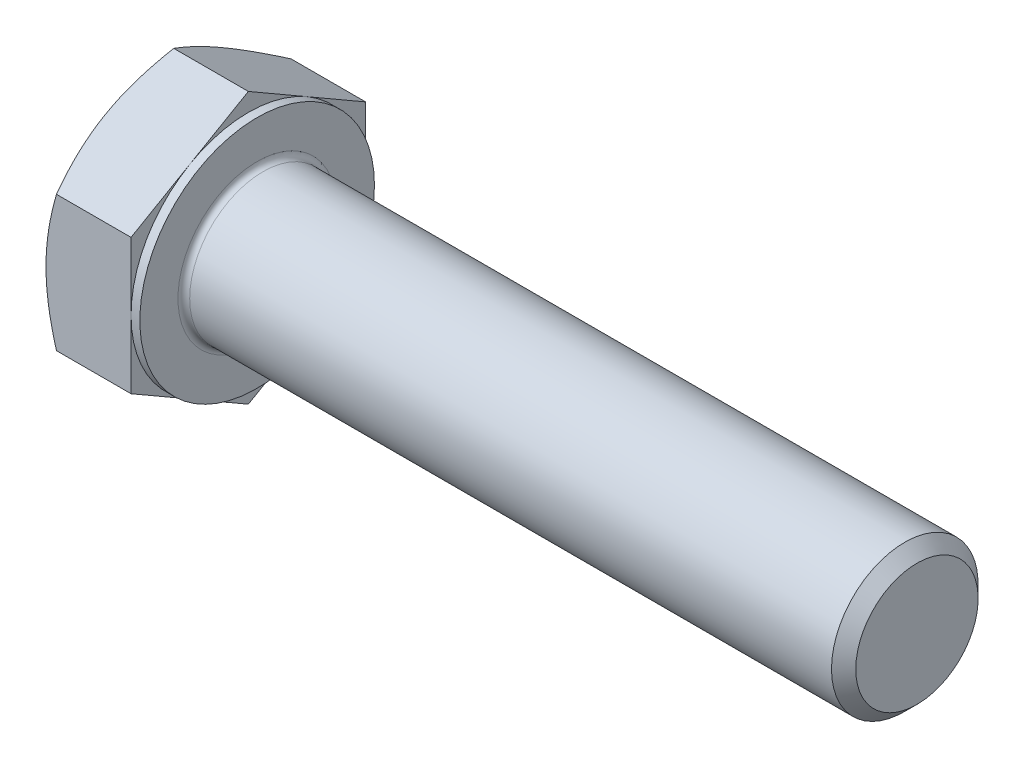
ISO-10303-21;
HEADER;
FILE_DESCRIPTION(('STEP AP214'),'2;1');
FILE_NAME('part.step','',(''),(''),'','','');
FILE_SCHEMA(('AUTOMOTIVE_DESIGN { 1 0 10303 214 1 1 1 1 }'));
ENDSEC;
DATA;
#1=APPLICATION_CONTEXT('core data for automotive mechanical design processes');
#2=APPLICATION_PROTOCOL_DEFINITION('international standard','automotive_design',2000,#1);
#3=PRODUCT_CONTEXT('',#1,'mechanical');
#4=PRODUCT('Part','Part','',(#3));
#5=PRODUCT_RELATED_PRODUCT_CATEGORY('part','',(#4));
#6=PRODUCT_DEFINITION_FORMATION('','',#4);
#7=PRODUCT_DEFINITION_CONTEXT('part definition',#1,'design');
#8=PRODUCT_DEFINITION('design','',#6,#7);
#9=PRODUCT_DEFINITION_SHAPE('','',#8);
#10=(LENGTH_UNIT() NAMED_UNIT(*) SI_UNIT(.MILLI.,.METRE.));
#11=(NAMED_UNIT(*) PLANE_ANGLE_UNIT() SI_UNIT($,.RADIAN.));
#12=(NAMED_UNIT(*) SI_UNIT($,.STERADIAN.) SOLID_ANGLE_UNIT());
#13=UNCERTAINTY_MEASURE_WITH_UNIT(LENGTH_MEASURE(1.E-05),#10,'distance_accuracy_value','');
#14=(GEOMETRIC_REPRESENTATION_CONTEXT(3) GLOBAL_UNCERTAINTY_ASSIGNED_CONTEXT((#13)) GLOBAL_UNIT_ASSIGNED_CONTEXT((#10,
#11,#12)) REPRESENTATION_CONTEXT('',''));
#15=CARTESIAN_POINT('',(0.,0.,0.));
#16=DIRECTION('',(0.,0.,1.));
#17=DIRECTION('',(1.,0.,0.));
#18=AXIS2_PLACEMENT_3D('',#15,#16,#17);
#19=CARTESIAN_POINT('',(6.4,9.23760430703402,0.));
#20=DIRECTION('',(1.,0.,0.));
#21=DIRECTION('',(0.,0.,-1.));
#22=AXIS2_PLACEMENT_3D('',#19,#20,#21);
#23=PLANE('',#22);
#24=CARTESIAN_POINT('',(6.4,0.,0.));
#25=DIRECTION('',(1.,0.,0.));
#26=DIRECTION('',(0.,0.,-1.));
#27=AXIS2_PLACEMENT_3D('',#24,#25,#26);
#28=CIRCLE('',#27,5.4);
#29=CARTESIAN_POINT('',(6.4,0.,-5.4));
#30=VERTEX_POINT('',#29);
#31=EDGE_CURVE('E42',#30,#30,#28,.F.);
#32=ORIENTED_EDGE('',*,*,#31,.T.);
#33=EDGE_LOOP('',(#32));
#34=FACE_BOUND('',#33,.T.);
#35=CARTESIAN_POINT('',(6.4,0.,0.));
#36=DIRECTION('',(1.,0.,0.));
#37=DIRECTION('',(0.,0.,-1.));
#38=AXIS2_PLACEMENT_3D('',#35,#36,#37);
#39=CIRCLE('',#38,8.);
#40=CARTESIAN_POINT('',(6.4,0.,-8.));
#41=VERTEX_POINT('',#40);
#42=EDGE_CURVE('E299',#41,#41,#39,.T.);
#43=ORIENTED_EDGE('',*,*,#42,.T.);
#44=EDGE_LOOP('',(#43));
#45=FACE_BOUND('',#44,.T.);
#46=ADVANCED_FACE('F34',(#34,#45),#23,.T.);
#47=CARTESIAN_POINT('',(0.,0.,0.));
#48=DIRECTION('',(-1.,0.,0.));
#49=DIRECTION('',(0.,0.,1.));
#50=AXIS2_PLACEMENT_3D('',#47,#48,#49);
#51=CYLINDRICAL_SURFACE('',#50,5.);
#52=CARTESIAN_POINT('',(6.8,0.,0.));
#53=DIRECTION('',(1.,0.,0.));
#54=DIRECTION('',(0.,0.,-1.));
#55=AXIS2_PLACEMENT_3D('',#52,#53,#54);
#56=CIRCLE('',#55,5.);
#57=CARTESIAN_POINT('',(6.8,0.,-5.));
#58=VERTEX_POINT('',#57);
#59=EDGE_CURVE('E11',#58,#58,#56,.T.);
#60=ORIENTED_EDGE('',*,*,#59,.T.);
#61=EDGE_LOOP('',(#60));
#62=FACE_BOUND('',#61,.T.);
#63=CARTESIAN_POINT('',(50.572,0.,0.));
#64=DIRECTION('',(-1.,0.,0.));
#65=DIRECTION('',(0.,0.,1.));
#66=AXIS2_PLACEMENT_3D('',#63,#64,#65);
#67=CIRCLE('',#66,5.);
#68=CARTESIAN_POINT('',(50.572,0.,5.));
#69=VERTEX_POINT('',#68);
#70=EDGE_CURVE('E278',#69,#69,#67,.T.);
#71=ORIENTED_EDGE('',*,*,#70,.T.);
#72=EDGE_LOOP('',(#71));
#73=FACE_BOUND('',#72,.T.);
#74=ADVANCED_FACE('F252',(#62,#73),#51,.T.);
#75=CARTESIAN_POINT('',(51.4,0.,0.));
#76=DIRECTION('',(-1.,0.,0.));
#77=DIRECTION('',(0.,0.,1.));
#78=AXIS2_PLACEMENT_3D('',#75,#76,#77);
#79=CONICAL_SURFACE('',#78,4.172,0.785398163397427);
#80=ORIENTED_EDGE('',*,*,#70,.F.);
#81=EDGE_LOOP('',(#80));
#82=FACE_BOUND('',#81,.T.);
#83=CARTESIAN_POINT('',(51.4,0.,0.));
#84=DIRECTION('',(-1.,0.,0.));
#85=DIRECTION('',(0.,0.,1.));
#86=AXIS2_PLACEMENT_3D('',#83,#84,#85);
#87=CIRCLE('',#86,4.172);
#88=CARTESIAN_POINT('',(51.4,0.,4.172));
#89=VERTEX_POINT('',#88);
#90=EDGE_CURVE('E276',#89,#89,#87,.T.);
#91=ORIENTED_EDGE('',*,*,#90,.T.);
#92=EDGE_LOOP('',(#91));
#93=FACE_BOUND('',#92,.T.);
#94=ADVANCED_FACE('F257',(#82,#93),#79,.T.);
#95=CARTESIAN_POINT('',(51.4,0.,0.));
#96=DIRECTION('',(-1.,0.,0.));
#97=DIRECTION('',(0.,0.,1.));
#98=AXIS2_PLACEMENT_3D('',#95,#96,#97);
#99=PLANE('',#98);
#100=ORIENTED_EDGE('',*,*,#90,.F.);
#101=EDGE_LOOP('',(#100));
#102=FACE_BOUND('',#101,.T.);
#103=ADVANCED_FACE('F264',(#102),#99,.F.);
#104=CARTESIAN_POINT('',(5.8,8.,0.));
#105=DIRECTION('',(1.,0.,0.));
#106=DIRECTION('',(0.,0.,-1.));
#107=AXIS2_PLACEMENT_3D('',#104,#105,#106);
#108=PLANE('',#107);
#109=DIRECTION('',(0.,0.500000000000001,0.866025403784438));
#110=VECTOR('',#109,1.);
#111=CARTESIAN_POINT('',(5.8,4.618802153517,-8.));
#112=LINE('',#111,#110);
#113=CARTESIAN_POINT('',(5.8,4.618802153517,-8.));
#114=VERTEX_POINT('',#113);
#115=CARTESIAN_POINT('',(5.8,6.9282032302755,-4.00000000000001));
#116=VERTEX_POINT('',#115);
#117=EDGE_CURVE('E166',#114,#116,#112,.T.);
#118=ORIENTED_EDGE('',*,*,#117,.T.);
#119=CARTESIAN_POINT('',(5.8,0.,0.));
#120=DIRECTION('',(-1.,0.,0.));
#121=DIRECTION('',(0.,0.,1.));
#122=AXIS2_PLACEMENT_3D('',#119,#120,#121);
#123=CIRCLE('',#122,8.);
#124=CARTESIAN_POINT('',(5.8,0.,-8.));
#125=VERTEX_POINT('',#124);
#126=EDGE_CURVE('E49',#116,#125,#123,.T.);
#127=ORIENTED_EDGE('',*,*,#126,.T.);
#128=DIRECTION('',(0.,1.,0.));
#129=VECTOR('',#128,1.);
#130=CARTESIAN_POINT('',(5.8,4.618802153517,-8.));
#131=LINE('',#130,#129);
#132=EDGE_CURVE('E302',#125,#114,#131,.T.);
#133=ORIENTED_EDGE('',*,*,#132,.T.);
#134=EDGE_LOOP('',(#118,#127,#133));
#135=FACE_BOUND('',#134,.T.);
#136=ADVANCED_FACE('F267',(#135),#108,.T.);
#137=CARTESIAN_POINT('',(5.8,9.23760430703402,0.));
#138=VERTEX_POINT('',#137);
#139=EDGE_CURVE('E164',#116,#138,#112,.T.);
#140=ORIENTED_EDGE('',*,*,#139,.T.);
#141=DIRECTION('',(0.,-0.500000000000001,0.866025403784438));
#142=VECTOR('',#141,1.);
#143=CARTESIAN_POINT('',(5.8,9.23760430703402,0.));
#144=LINE('',#143,#142);
#145=CARTESIAN_POINT('',(5.8,6.92820323027551,4.00000000000001));
#146=VERTEX_POINT('',#145);
#147=EDGE_CURVE('E163',#138,#146,#144,.T.);
#148=ORIENTED_EDGE('',*,*,#147,.T.);
#149=EDGE_CURVE('E152',#146,#116,#123,.T.);
#150=ORIENTED_EDGE('',*,*,#149,.T.);
#151=EDGE_LOOP('',(#140,#148,#150));
#152=FACE_BOUND('',#151,.T.);
#153=ADVANCED_FACE('F272',(#152),#108,.T.);
#154=CARTESIAN_POINT('',(5.8,4.618802153517,8.));
#155=VERTEX_POINT('',#154);
#156=EDGE_CURVE('E131',#146,#155,#144,.T.);
#157=ORIENTED_EDGE('',*,*,#156,.T.);
#158=DIRECTION('',(0.,-1.,0.));
#159=VECTOR('',#158,1.);
#160=CARTESIAN_POINT('',(5.8,4.618802153517,8.));
#161=LINE('',#160,#159);
#162=CARTESIAN_POINT('',(5.8,0.,8.));
#163=VERTEX_POINT('',#162);
#164=EDGE_CURVE('E125',#155,#163,#161,.T.);
#165=ORIENTED_EDGE('',*,*,#164,.T.);
#166=EDGE_CURVE('E129',#163,#146,#123,.T.);
#167=ORIENTED_EDGE('',*,*,#166,.T.);
#168=EDGE_LOOP('',(#157,#165,#167));
#169=FACE_BOUND('',#168,.T.);
#170=ADVANCED_FACE('F127',(#169),#108,.T.);
#171=CARTESIAN_POINT('',(5.8,-4.61880215351699,8.));
#172=VERTEX_POINT('',#171);
#173=EDGE_CURVE('E135',#163,#172,#161,.T.);
#174=ORIENTED_EDGE('',*,*,#173,.T.);
#175=DIRECTION('',(0.,-0.500000000000002,-0.866025403784438));
#176=VECTOR('',#175,1.);
#177=CARTESIAN_POINT('',(5.8,-9.23760430703402,0.));
#178=LINE('',#177,#176);
#179=CARTESIAN_POINT('',(5.8,-6.9282032302755,4.00000000000002));
#180=VERTEX_POINT('',#179);
#181=EDGE_CURVE('E142',#172,#180,#178,.T.);
#182=ORIENTED_EDGE('',*,*,#181,.T.);
#183=EDGE_CURVE('E139',#180,#163,#123,.T.);
#184=ORIENTED_EDGE('',*,*,#183,.T.);
#185=EDGE_LOOP('',(#174,#182,#184));
#186=FACE_BOUND('',#185,.T.);
#187=ADVANCED_FACE('F140',(#186),#108,.T.);
#188=CARTESIAN_POINT('',(5.8,-9.23760430703402,0.));
#189=VERTEX_POINT('',#188);
#190=EDGE_CURVE('E158',#180,#189,#178,.T.);
#191=ORIENTED_EDGE('',*,*,#190,.T.);
#192=DIRECTION('',(0.,0.5,-0.866025403784439));
#193=VECTOR('',#192,1.);
#194=CARTESIAN_POINT('',(5.8,-4.61880215351701,-8.));
#195=LINE('',#194,#193);
#196=CARTESIAN_POINT('',(5.8,-6.92820323027551,-4.));
#197=VERTEX_POINT('',#196);
#198=EDGE_CURVE('E340',#189,#197,#195,.T.);
#199=ORIENTED_EDGE('',*,*,#198,.T.);
#200=EDGE_CURVE('E146',#197,#180,#123,.T.);
#201=ORIENTED_EDGE('',*,*,#200,.T.);
#202=EDGE_LOOP('',(#191,#199,#201));
#203=FACE_BOUND('',#202,.T.);
#204=ADVANCED_FACE('F341',(#203),#108,.T.);
#205=CARTESIAN_POINT('',(5.8,-4.61880215351701,-8.));
#206=VERTEX_POINT('',#205);
#207=EDGE_CURVE('E153',#197,#206,#195,.T.);
#208=ORIENTED_EDGE('',*,*,#207,.T.);
#209=EDGE_CURVE('E303',#206,#125,#131,.T.);
#210=ORIENTED_EDGE('',*,*,#209,.T.);
#211=EDGE_CURVE('E310',#125,#197,#123,.T.);
#212=ORIENTED_EDGE('',*,*,#211,.T.);
#213=EDGE_LOOP('',(#208,#210,#212));
#214=FACE_BOUND('',#213,.T.);
#215=ADVANCED_FACE('F273',(#214),#108,.T.);
#216=CARTESIAN_POINT('',(0.,0.,0.));
#217=DIRECTION('',(-1.,0.,0.));
#218=DIRECTION('',(0.,0.,1.));
#219=AXIS2_PLACEMENT_3D('',#216,#217,#218);
#220=CYLINDRICAL_SURFACE('',#219,8.);
#221=ORIENTED_EDGE('',*,*,#126,.F.);
#222=ORIENTED_EDGE('',*,*,#149,.F.);
#223=ORIENTED_EDGE('',*,*,#166,.F.);
#224=ORIENTED_EDGE('',*,*,#183,.F.);
#225=ORIENTED_EDGE('',*,*,#200,.F.);
#226=ORIENTED_EDGE('',*,*,#211,.F.);
#227=EDGE_LOOP('',(#221,#222,#223,#224,#225,#226));
#228=FACE_BOUND('',#227,.T.);
#229=ORIENTED_EDGE('',*,*,#42,.F.);
#230=EDGE_LOOP('',(#229));
#231=FACE_BOUND('',#230,.T.);
#232=ADVANCED_FACE('F149',(#228,#231),#220,.T.);
#233=CARTESIAN_POINT('',(0.,9.23760430703402,0.));
#234=DIRECTION('',(1.,0.,0.));
#235=DIRECTION('',(0.,0.,-1.));
#236=AXIS2_PLACEMENT_3D('',#233,#234,#235);
#237=PLANE('',#236);
#238=CARTESIAN_POINT('',(0.,0.,0.));
#239=DIRECTION('',(1.,0.,0.));
#240=DIRECTION('',(0.,0.,-1.));
#241=AXIS2_PLACEMENT_3D('',#238,#239,#240);
#242=CIRCLE('',#241,8.);
#243=CARTESIAN_POINT('',(0.,0.,-8.));
#244=VERTEX_POINT('',#243);
#245=CARTESIAN_POINT('',(0.,6.9282032302755,-4.00000000000001));
#246=VERTEX_POINT('',#245);
#247=EDGE_CURVE('E298',#244,#246,#242,.T.);
#248=ORIENTED_EDGE('',*,*,#247,.F.);
#249=CARTESIAN_POINT('',(0.,-6.92820323027551,-4.));
#250=VERTEX_POINT('',#249);
#251=EDGE_CURVE('E294',#250,#244,#242,.T.);
#252=ORIENTED_EDGE('',*,*,#251,.F.);
#253=CARTESIAN_POINT('',(0.,-6.9282032302755,4.00000000000002));
#254=VERTEX_POINT('',#253);
#255=EDGE_CURVE('E297',#254,#250,#242,.T.);
#256=ORIENTED_EDGE('',*,*,#255,.F.);
#257=CARTESIAN_POINT('',(0.,0.,8.));
#258=VERTEX_POINT('',#257);
#259=EDGE_CURVE('E333',#258,#254,#242,.T.);
#260=ORIENTED_EDGE('',*,*,#259,.F.);
#261=CARTESIAN_POINT('',(0.,0.,0.));
#262=DIRECTION('',(-1.,0.,0.));
#263=DIRECTION('',(0.,0.,1.));
#264=AXIS2_PLACEMENT_3D('',#261,#262,#263);
#265=CIRCLE('',#264,8.);
#266=CARTESIAN_POINT('',(0.,6.92820323027551,4.00000000000001));
#267=VERTEX_POINT('',#266);
#268=EDGE_CURVE('E167',#258,#267,#265,.T.);
#269=ORIENTED_EDGE('',*,*,#268,.T.);
#270=EDGE_CURVE('E356',#246,#267,#242,.T.);
#271=ORIENTED_EDGE('',*,*,#270,.F.);
#272=EDGE_LOOP('',(#248,#252,#256,#260,#269,#271));
#273=FACE_BOUND('',#272,.T.);
#274=ADVANCED_FACE('F198',(#273),#237,.F.);
#275=CARTESIAN_POINT('',(0.,0.,0.));
#276=DIRECTION('',(1.,0.,0.));
#277=DIRECTION('',(0.,0.,-1.));
#278=AXIS2_PLACEMENT_3D('',#275,#276,#277);
#279=CONICAL_SURFACE('',#278,8.,1.0471975511966);
#280=CARTESIAN_POINT('',(0.714597847732974,4.61868668346316,8.0002));
#281=CARTESIAN_POINT('',(0.655990714047299,4.72021302617289,7.82435121612011));
#282=CARTESIAN_POINT('',(0.600043401047291,4.82211789504563,7.64784680569387));
#283=CARTESIAN_POINT('',(0.494201005024667,5.02675523421805,7.29340453712154));
#284=CARTESIAN_POINT('',(0.444308534431067,5.12948804149869,7.11546609530729));
#285=CARTESIAN_POINT('',(0.304692797206866,5.43933133858026,6.57880176237736));
#286=CARTESIAN_POINT('',(0.225281170978368,5.64766491807817,6.21795741776428));
#287=CARTESIAN_POINT('',(0.132161646294488,5.95943209350317,5.67796082979595));
#288=CARTESIAN_POINT('',(0.105634581029124,6.06193429416807,5.50042181035672));
#289=CARTESIAN_POINT('',(0.0611531748588753,6.26740224104454,5.1445408870398));
#290=CARTESIAN_POINT('',(0.0431980765145794,6.37036794548792,4.96619905550676));
#291=CARTESIAN_POINT('',(0.0163156484918644,6.57647664551585,4.60920831517641));
#292=CARTESIAN_POINT('',(0.00737807354623249,6.67961930623067,4.4305599863905));
#293=CARTESIAN_POINT('',(-0.00127769603487075,6.88599991003618,4.07309829490262));
#294=CARTESIAN_POINT('',(-0.000996175497150744,6.98923785008464,3.89428493746994));
#295=CARTESIAN_POINT('',(0.00814502526877543,7.18224506616975,3.5599866329831));
#296=CARTESIAN_POINT('',(0.0158896043673698,7.27202796205376,3.40447809566133));
#297=CARTESIAN_POINT('',(0.0382011348534285,7.45138347289924,3.09382523825949));
#298=CARTESIAN_POINT('',(0.0527685461381475,7.5409560732765,2.93868094344));
#299=CARTESIAN_POINT('',(0.106360690527535,7.80932710333148,2.47384868410519));
#300=CARTESIAN_POINT('',(0.155268641669143,7.98765049311728,2.16498351281828));
#301=CARTESIAN_POINT('',(0.277539403234313,8.34618890253624,1.5439767712397));
#302=CARTESIAN_POINT('',(0.351420520376,8.52635816315522,1.23191445788552));
#303=CARTESIAN_POINT('',(0.519100141254973,8.88400987687704,0.612443518305241));
#304=CARTESIAN_POINT('',(0.612859260854457,9.06149691008278,0.305026959108249));
#305=CARTESIAN_POINT('',(0.714597847732977,9.23771977708786,-0.00019999999999971));
#306=B_SPLINE_CURVE_WITH_KNOTS('',3,(#280,#281,#282,#283,#284,#285,#286,#287,#288,#289,#290,
#291,#292,#293,#294,#295,#296,#297,#298,#299,#300,#301,#302,#303,#304,#305),.UNSPECIFIED.,.F.,
.F.,(4,2,2,2,2,2,2,2,2,2,2,2,4),(0.,0.633973543721352,1.26821965714356,2.53934712434766,
3.15934343977049,3.77928496069784,4.39852133866766,5.01773858515595,5.55680239410249,
6.09590254421148,7.17487077411835,8.27776850154293,9.37850115249055),.UNSPECIFIED.);
#307=CARTESIAN_POINT('',(0.714531179816326,9.23760430703402,0.));
#308=VERTEX_POINT('',#307);
#309=EDGE_CURVE('E218',#267,#308,#306,.T.);
#310=ORIENTED_EDGE('',*,*,#309,.T.);
#311=CARTESIAN_POINT('',(0.714597847732978,9.23771977708786,0.0002));
#312=CARTESIAN_POINT('',(0.655990714047302,9.13619343437813,-0.175648783879896));
#313=CARTESIAN_POINT('',(0.600043401047294,9.03428856550538,-0.352153194306135));
#314=CARTESIAN_POINT('',(0.49420100502467,8.82965122633297,-0.70659546287846));
#315=CARTESIAN_POINT('',(0.44430853443107,8.72691841905233,-0.884533904692713));
#316=CARTESIAN_POINT('',(0.304692797206868,8.41707512197076,-1.42119823762264));
#317=CARTESIAN_POINT('',(0.225281170978369,8.20874154247284,-1.78204258223572));
#318=CARTESIAN_POINT('',(0.132161646294489,7.89697436704785,-2.32203917020405));
#319=CARTESIAN_POINT('',(0.105634581029125,7.79447216638295,-2.49957818964329));
#320=CARTESIAN_POINT('',(0.0611531748588759,7.58900421950647,-2.8554591129602));
#321=CARTESIAN_POINT('',(0.0431980765145796,7.4860385150631,-3.03380094449324));
#322=CARTESIAN_POINT('',(0.0163156484918642,7.27992981503517,-3.39079168482359));
#323=CARTESIAN_POINT('',(0.00737807354623245,7.17678715432034,-3.5694400136095));
#324=CARTESIAN_POINT('',(-0.00127769603487121,6.97040655051484,-3.92690170509738));
#325=CARTESIAN_POINT('',(-0.000996175497151779,6.86716861046638,-4.10571506253007));
#326=CARTESIAN_POINT('',(0.00814502526877328,6.67416139438126,-4.4400133670169));
#327=CARTESIAN_POINT('',(0.0158896043673671,6.58437849849726,-4.59552190433867));
#328=CARTESIAN_POINT('',(0.0382011348534254,6.40502298765178,-4.90617476174051));
#329=CARTESIAN_POINT('',(0.0527685461381446,6.31545038727451,-5.06131905656));
#330=CARTESIAN_POINT('',(0.106360690527533,6.04707935721953,-5.52615131589482));
#331=CARTESIAN_POINT('',(0.15526864166914,5.86875596743374,-5.83501648718172));
#332=CARTESIAN_POINT('',(0.277539403234309,5.51021755801477,-6.4560232287603));
#333=CARTESIAN_POINT('',(0.351420520375995,5.3300482973958,-6.76808554211448));
#334=CARTESIAN_POINT('',(0.519100141254967,4.97239658367397,-7.38755648169476));
#335=CARTESIAN_POINT('',(0.612859260854451,4.79490955046824,-7.69497304089175));
#336=CARTESIAN_POINT('',(0.714597847732972,4.61868668346316,-8.0002));
#337=B_SPLINE_CURVE_WITH_KNOTS('',3,(#311,#312,#313,#314,#315,#316,#317,#318,#319,#320,#321,
#322,#323,#324,#325,#326,#327,#328,#329,#330,#331,#332,#333,#334,#335,#336),.UNSPECIFIED.,.F.,
.F.,(4,2,2,2,2,2,2,2,2,2,2,2,4),(0.,0.633973543721351,1.26821965714356,2.53934712434766,
3.15934343977049,3.77928496069784,4.39852133866766,5.01773858515595,5.55680239410249,
6.09590254421148,7.17487077411835,8.27776850154293,9.37850115249055),.UNSPECIFIED.);
#338=EDGE_CURVE('E57',#308,#246,#337,.T.);
#339=ORIENTED_EDGE('',*,*,#338,.T.);
#340=ORIENTED_EDGE('',*,*,#270,.T.);
#341=EDGE_LOOP('',(#310,#339,#340));
#342=FACE_BOUND('',#341,.T.);
#343=ADVANCED_FACE('F357',(#342),#279,.T.);
#344=CARTESIAN_POINT('',(4.02490590955891,-12.6546855843617,7.99999999999999));
#345=CARTESIAN_POINT('',(3.85338487375992,-12.3031246800229,7.99999999999999));
#346=CARTESIAN_POINT('',(3.68343819387202,-11.9507829192251,7.99999999999999));
#347=CARTESIAN_POINT('',(3.34757427772116,-11.2441233293434,7.99999999999999));
#348=CARTESIAN_POINT('',(3.18165763115451,-10.8898052202859,8.));
#349=CARTESIAN_POINT('',(2.85395194343768,-10.1770689379398,8.));
#350=CARTESIAN_POINT('',(2.69218824963992,-9.8186390717221,8.));
#351=CARTESIAN_POINT('',(2.3749572674034,-9.09901412811099,8.));
#352=CARTESIAN_POINT('',(2.21948969724235,-8.73781917530421,8.));
#353=CARTESIAN_POINT('',(1.91124909611307,-7.99950051377994,8.));
#354=CARTESIAN_POINT('',(1.75875676572667,-7.6222589905811,8.));
#355=CARTESIAN_POINT('',(1.4647241129891,-6.86345576673941,8.));
#356=CARTESIAN_POINT('',(1.32318498461757,-6.48189360029687,8.));
#357=CARTESIAN_POINT('',(1.05459432501408,-5.71447512364443,8.));
#358=CARTESIAN_POINT('',(0.927515476081563,-5.32862847439954,8.));
#359=CARTESIAN_POINT('',(0.691757211097745,-4.55141880373956,8.));
#360=CARTESIAN_POINT('',(0.583072254842117,-4.16005748194272,8.));
#361=CARTESIAN_POINT('',(0.389750376844221,-3.37376378274519,8.));
#362=CARTESIAN_POINT('',(0.304973724086276,-2.97886668674348,8.));
#363=CARTESIAN_POINT('',(0.19927520023723,-2.38273452840881,8.));
#364=CARTESIAN_POINT('',(0.167618755709461,-2.18337977711938,8.));
#365=CARTESIAN_POINT('',(0.112075358694774,-1.78359737601684,8.));
#366=CARTESIAN_POINT('',(0.0881876500546171,-1.58316983255304,8.));
#367=CARTESIAN_POINT('',(0.0489706977401164,-1.18423542027824,8.));
#368=CARTESIAN_POINT('',(0.0335291730980846,-0.985739637458754,8.));
#369=CARTESIAN_POINT('',(0.0110629716488637,-0.588272086946668,8.));
#370=CARTESIAN_POINT('',(0.00403814825767087,-0.389300327604079,8.));
#371=CARTESIAN_POINT('',(-0.00142584062082056,0.0087622108148497,8.));
#372=CARTESIAN_POINT('',(0.000134957676475296,0.207852989385608,8.));
#373=CARTESIAN_POINT('',(0.0118014217876193,0.605786203078691,8.));
#374=CARTESIAN_POINT('',(0.0219074673810713,0.804628626769926,8.));
#375=CARTESIAN_POINT('',(0.0557165373437167,1.27520491378394,8.));
#376=CARTESIAN_POINT('',(0.0830672695242096,1.54668291471765,8.));
#377=CARTESIAN_POINT('',(0.152259238389073,2.08777092307493,8.));
#378=CARTESIAN_POINT('',(0.194102243863658,2.35738069838157,8.));
#379=CARTESIAN_POINT('',(0.339163188799743,3.16301774665639,8.));
#380=CARTESIAN_POINT('',(0.461891294668975,3.69558688173418,8.));
#381=CARTESIAN_POINT('',(0.67658659521306,4.49226053267631,8.));
#382=CARTESIAN_POINT('',(0.75430185010613,4.76044512009594,8.));
#383=CARTESIAN_POINT('',(0.918275616254536,5.29421544036087,8.));
#384=CARTESIAN_POINT('',(1.00453419017724,5.55980115412707,8.));
#385=CARTESIAN_POINT('',(1.18417203245489,6.0884483689393,8.));
#386=CARTESIAN_POINT('',(1.27754931556252,6.35151055086866,8.));
#387=CARTESIAN_POINT('',(1.47027924561323,6.87542420819582,8.));
#388=CARTESIAN_POINT('',(1.56963178297477,7.1362757240355,8.));
#389=CARTESIAN_POINT('',(1.83061788216801,7.80218874880574,8.));
#390=CARTESIAN_POINT('',(1.99585030591404,8.20583800152902,8.));
#391=CARTESIAN_POINT('',(2.33560643435574,9.00922090340246,8.));
#392=CARTESIAN_POINT('',(2.51013099317421,9.40895418858892,8.));
#393=CARTESIAN_POINT('',(2.86641484762338,10.2053302393418,8.));
#394=CARTESIAN_POINT('',(3.04817649203489,10.6019719507727,8.));
#395=CARTESIAN_POINT('',(3.41731474780413,11.3926098653434,8.));
#396=CARTESIAN_POINT('',(3.60469117417197,11.7866061551194,8.00000000000001));
#397=CARTESIAN_POINT('',(3.98417976786821,12.5730081264133,8.00000000000001));
#398=CARTESIAN_POINT('',(4.17629837893026,12.9654106921397,8.00000000000001));
#399=CARTESIAN_POINT('',(4.56413460673707,13.7484335593548,8.00000000000001));
#400=CARTESIAN_POINT('',(4.75985224746019,14.1390538489476,8.00000000000001));
#401=CARTESIAN_POINT('',(5.15417790496087,14.9187386930099,8.00000000000001));
#402=CARTESIAN_POINT('',(5.3527853705295,15.3078035265797,8.00000000000001));
#403=CARTESIAN_POINT('',(5.75241277357116,16.0846929446672,8.00000000000001));
#404=CARTESIAN_POINT('',(5.95343272118932,16.4725175239607,8.00000000000001));
#405=CARTESIAN_POINT('',(6.52023157707933,17.5591699504467,8.00000000000001));
#406=CARTESIAN_POINT('',(6.8882666916266,18.2568207923884,8.00000000000001));
#407=CARTESIAN_POINT('',(7.62911645716787,19.6496204420456,8.00000000000001));
#408=CARTESIAN_POINT('',(8.00193135552977,20.3447691178627,8.00000000000001));
#409=CARTESIAN_POINT('',(8.74998840178782,21.7309493426279,8.00000000000001));
#410=CARTESIAN_POINT('',(9.1252192979029,22.4219869677796,8.00000000000001));
#411=CARTESIAN_POINT('',(9.69012625678305,23.4573861735835,8.00000000000001));
#412=CARTESIAN_POINT('',(9.87876537279047,23.8023143161837,8.00000000000001));
#413=CARTESIAN_POINT('',(10.2566598278908,24.4918321964471,8.00000000000001));
#414=CARTESIAN_POINT('',(10.4459151660088,24.8364219346447,8.00000000000001));
#415=CARTESIAN_POINT('',(10.635441440782,25.1808626322182,8.00000000000001));
#416=B_SPLINE_CURVE_WITH_KNOTS('',3,(#344,#345,#346,#347,#348,#349,#350,#351,#352,#353,#354,
#355,#356,#357,#358,#359,#360,#361,#362,#363,#364,#365,#366,#367,#368,#369,#370,#371,#372,#373,
#374,#375,#376,#377,#378,#379,#380,#381,#382,#383,#384,#385,#386,#387,#388,#389,#390,#391,#392,
#393,#394,#395,#396,#397,#398,#399,#400,#401,#402,#403,#404,#405,#406,#407,#408,#409,#410,#411,
#412,#413,#414,#415),.UNSPECIFIED.,.F.,.F.,(4,2,2,2,2,2,2,2,2,2,2,2,2,2,2,2,2,2,2,2,2,2,2,2,2,2,
2,2,2,2,2,2,2,2,2,4),(0.,1.1735253428552,2.34722138025917,3.52689945010166,4.70652467637677,
5.92708317141316,7.1477745294408,8.36612012171133,9.58409809506409,10.7948027119676,
11.4002329189197,12.0056041799731,12.6027191107726,13.199823642157,13.7969256548693,
14.3940542062034,15.2121538291978,16.0303533369241,17.6675489652002,18.5051258655031,
19.3427089100958,20.1800592201861,21.0173941785985,22.3257038346385,23.6341339573728,
24.9429922461244,26.2518074593073,27.5625113626671,28.8732240016859,30.1836898283921,
31.4941611678941,33.8604585893124,36.2268789719357,38.5858914350282,39.7653150976311,
40.9447368953005),.UNSPECIFIED.);
#417=CARTESIAN_POINT('',(0.714531179816322,4.618802153517,8.));
#418=VERTEX_POINT('',#417);
#419=EDGE_CURVE('E232',#258,#418,#416,.T.);
#420=ORIENTED_EDGE('',*,*,#419,.T.);
#421=EDGE_CURVE('E231',#418,#267,#306,.T.);
#422=ORIENTED_EDGE('',*,*,#421,.T.);
#423=ORIENTED_EDGE('',*,*,#268,.F.);
#424=EDGE_LOOP('',(#420,#422,#423));
#425=FACE_BOUND('',#424,.T.);
#426=ADVANCED_FACE('F327',(#425),#279,.T.);
#427=CARTESIAN_POINT('',(0.714531179816317,-4.61880215351699,8.));
#428=VERTEX_POINT('',#427);
#429=EDGE_CURVE('E279',#428,#258,#416,.T.);
#430=ORIENTED_EDGE('',*,*,#429,.T.);
#431=ORIENTED_EDGE('',*,*,#259,.T.);
#432=CARTESIAN_POINT('',(0.714597847732978,-9.23771977708786,-0.000200000000000067));
#433=CARTESIAN_POINT('',(0.655990714047303,-9.13619343437813,0.175648783879897));
#434=CARTESIAN_POINT('',(0.600043401047294,-9.03428856550538,0.352153194306135));
#435=CARTESIAN_POINT('',(0.494201005024669,-8.82965122633297,0.706595462878459));
#436=CARTESIAN_POINT('',(0.444308534431069,-8.72691841905233,0.884533904692712));
#437=CARTESIAN_POINT('',(0.304692797206866,-8.41707512197076,1.42119823762264));
#438=CARTESIAN_POINT('',(0.225281170978369,-8.20874154247284,1.78204258223572));
#439=CARTESIAN_POINT('',(0.132161646294488,-7.89697436704785,2.32203917020405));
#440=CARTESIAN_POINT('',(0.105634581029124,-7.79447216638294,2.49957818964328));
#441=CARTESIAN_POINT('',(0.0611531748588747,-7.58900421950647,2.8554591129602));
#442=CARTESIAN_POINT('',(0.0431980765145787,-7.4860385150631,3.03380094449324));
#443=CARTESIAN_POINT('',(0.0163156484918626,-7.27992981503516,3.39079168482359));
#444=CARTESIAN_POINT('',(0.00737807354622979,-7.17678715432034,3.5694400136095));
#445=CARTESIAN_POINT('',(-0.0012776960348743,-6.97040655051483,3.92690170509738));
#446=CARTESIAN_POINT('',(-0.000996175497154247,-6.86716861046637,4.10571506253006));
#447=CARTESIAN_POINT('',(0.00814502526877121,-6.67416139438126,4.4400133670169));
#448=CARTESIAN_POINT('',(0.0158896043673649,-6.58437849849725,4.59552190433867));
#449=CARTESIAN_POINT('',(0.0382011348534229,-6.40502298765177,4.90617476174051));
#450=CARTESIAN_POINT('',(0.0527685461381419,-6.31545038727451,5.06131905656));
#451=CARTESIAN_POINT('',(0.10636069052753,-6.04707935721953,5.52615131589482));
#452=CARTESIAN_POINT('',(0.155268641669138,-5.86875596743373,5.83501648718172));
#453=CARTESIAN_POINT('',(0.277539403234307,-5.51021755801476,6.4560232287603));
#454=CARTESIAN_POINT('',(0.351420520375992,-5.33004829739579,6.76808554211448));
#455=CARTESIAN_POINT('',(0.519100141254964,-4.97239658367396,7.38755648169476));
#456=CARTESIAN_POINT('',(0.612859260854447,-4.79490955046823,7.69497304089175));
#457=CARTESIAN_POINT('',(0.714597847732969,-4.61868668346315,8.0002));
#458=B_SPLINE_CURVE_WITH_KNOTS('',3,(#432,#433,#434,#435,#436,#437,#438,#439,#440,#441,#442,
#443,#444,#445,#446,#447,#448,#449,#450,#451,#452,#453,#454,#455,#456,#457),.UNSPECIFIED.,.F.,
.F.,(4,2,2,2,2,2,2,2,2,2,2,2,4),(0.,0.633973543721351,1.26821965714356,2.53934712434766,
3.15934343977049,3.77928496069784,4.39852133866766,5.01773858515596,5.55680239410249,
6.09590254421148,7.17487077411836,8.27776850154294,9.37850115249056),.UNSPECIFIED.);
#459=EDGE_CURVE('E220',#254,#428,#458,.T.);
#460=ORIENTED_EDGE('',*,*,#459,.T.);
#461=EDGE_LOOP('',(#430,#431,#460));
#462=FACE_BOUND('',#461,.T.);
#463=ADVANCED_FACE('F187',(#462),#279,.T.);
#464=CARTESIAN_POINT('',(0.714531179816326,-9.23760430703402,0.));
#465=VERTEX_POINT('',#464);
#466=EDGE_CURVE('E212',#465,#254,#458,.T.);
#467=ORIENTED_EDGE('',*,*,#466,.T.);
#468=ORIENTED_EDGE('',*,*,#255,.T.);
#469=CARTESIAN_POINT('',(0.714597847732977,-4.61868668346318,-8.0002));
#470=CARTESIAN_POINT('',(0.655990714047302,-4.7202130261729,-7.8243512161201));
#471=CARTESIAN_POINT('',(0.600043401047294,-4.82211789504565,-7.64784680569386));
#472=CARTESIAN_POINT('',(0.49420100502467,-5.02675523421806,-7.29340453712154));
#473=CARTESIAN_POINT('',(0.44430853443107,-5.1294880414987,-7.11546609530729));
#474=CARTESIAN_POINT('',(0.304692797206869,-5.43933133858027,-6.57880176237736));
#475=CARTESIAN_POINT('',(0.225281170978371,-5.64766491807818,-6.21795741776427));
#476=CARTESIAN_POINT('',(0.132161646294491,-5.95943209350318,-5.67796082979595));
#477=CARTESIAN_POINT('',(0.105634581029127,-6.06193429416808,-5.50042181035671));
#478=CARTESIAN_POINT('',(0.0611531748588784,-6.26740224104456,-5.1445408870398));
#479=CARTESIAN_POINT('',(0.0431980765145827,-6.37036794548793,-4.96619905550676));
#480=CARTESIAN_POINT('',(0.0163156484918676,-6.57647664551586,-4.6092083151764));
#481=CARTESIAN_POINT('',(0.00737807354623552,-6.67961930623068,-4.4305599863905));
#482=CARTESIAN_POINT('',(-0.00127769603486777,-6.88599991003619,-4.07309829490261));
#483=CARTESIAN_POINT('',(-0.000996175497147636,-6.98923785008465,-3.89428493746993));
#484=CARTESIAN_POINT('',(0.00814502526877858,-7.18224506616976,-3.55998663298309));
#485=CARTESIAN_POINT('',(0.0158896043673729,-7.27202796205377,-3.40447809566132));
#486=CARTESIAN_POINT('',(0.0382011348534314,-7.45138347289925,-3.09382523825949));
#487=CARTESIAN_POINT('',(0.0527685461381502,-7.54095607327651,-2.93868094344));
#488=CARTESIAN_POINT('',(0.106360690527538,-7.80932710333149,-2.47384868410518));
#489=CARTESIAN_POINT('',(0.155268641669146,-7.98765049311728,-2.16498351281828));
#490=CARTESIAN_POINT('',(0.277539403234316,-8.34618890253625,-1.5439767712397));
#491=CARTESIAN_POINT('',(0.351420520376001,-8.52635816315522,-1.23191445788552));
#492=CARTESIAN_POINT('',(0.519100141254973,-8.88400987687704,-0.612443518305241));
#493=CARTESIAN_POINT('',(0.612859260854456,-9.06149691008278,-0.305026959108249));
#494=CARTESIAN_POINT('',(0.714597847732976,-9.23771977708786,0.000200000000000302));
#495=B_SPLINE_CURVE_WITH_KNOTS('',3,(#469,#470,#471,#472,#473,#474,#475,#476,#477,#478,#479,
#480,#481,#482,#483,#484,#485,#486,#487,#488,#489,#490,#491,#492,#493,#494),.UNSPECIFIED.,.F.,
.F.,(4,2,2,2,2,2,2,2,2,2,2,2,4),(0.,0.633973543721352,1.26821965714356,2.53934712434766,
3.15934343977049,3.77928496069784,4.39852133866766,5.01773858515595,5.55680239410249,
6.09590254421148,7.17487077411835,8.27776850154292,9.37850115249054),.UNSPECIFIED.);
#496=EDGE_CURVE('E219',#250,#465,#495,.T.);
#497=ORIENTED_EDGE('',*,*,#496,.T.);
#498=EDGE_LOOP('',(#467,#468,#497));
#499=FACE_BOUND('',#498,.T.);
#500=ADVANCED_FACE('F355',(#499),#279,.T.);
#501=CARTESIAN_POINT('',(0.71453117981632,4.618802153517,-8.));
#502=VERTEX_POINT('',#501);
#503=EDGE_CURVE('E221',#246,#502,#337,.T.);
#504=ORIENTED_EDGE('',*,*,#503,.T.);
#505=CARTESIAN_POINT('',(4.02490590955892,-12.6546855843617,-8.));
#506=CARTESIAN_POINT('',(3.85338487375994,-12.3031246800229,-8.));
#507=CARTESIAN_POINT('',(3.68343819387203,-11.9507829192251,-8.));
#508=CARTESIAN_POINT('',(3.34757427772118,-11.2441233293434,-8.));
#509=CARTESIAN_POINT('',(3.18165763115452,-10.889805220286,-8.));
#510=CARTESIAN_POINT('',(2.85395194343769,-10.1770689379399,-8.));
#511=CARTESIAN_POINT('',(2.69218824963993,-9.81863907172212,-8.));
#512=CARTESIAN_POINT('',(2.37495726740341,-9.09901412811101,-8.));
#513=CARTESIAN_POINT('',(2.21948969724236,-8.73781917530424,-8.));
#514=CARTESIAN_POINT('',(1.91124909611308,-7.99950051377997,-8.));
#515=CARTESIAN_POINT('',(1.75875676572668,-7.62225899058113,-8.));
#516=CARTESIAN_POINT('',(1.46472411298911,-6.86345576673944,-8.));
#517=CARTESIAN_POINT('',(1.32318498461758,-6.4818936002969,-8.));
#518=CARTESIAN_POINT('',(1.05459432501409,-5.71447512364446,-8.));
#519=CARTESIAN_POINT('',(0.927515476081571,-5.32862847439956,-8.));
#520=CARTESIAN_POINT('',(0.691757211097752,-4.55141880373959,-8.));
#521=CARTESIAN_POINT('',(0.583072254842124,-4.16005748194275,-8.));
#522=CARTESIAN_POINT('',(0.389750376844227,-3.37376378274521,-8.));
#523=CARTESIAN_POINT('',(0.304973724086282,-2.9788666867435,-8.));
#524=CARTESIAN_POINT('',(0.199275200237234,-2.38273452840883,-8.));
#525=CARTESIAN_POINT('',(0.167618755709465,-2.18337977711941,-8.));
#526=CARTESIAN_POINT('',(0.112075358694778,-1.78359737601687,-8.));
#527=CARTESIAN_POINT('',(0.0881876500546208,-1.58316983255306,-8.));
#528=CARTESIAN_POINT('',(0.0489706977401194,-1.18423542027826,-8.));
#529=CARTESIAN_POINT('',(0.0335291730980864,-0.985739637458776,-8.));
#530=CARTESIAN_POINT('',(0.0110629716488641,-0.58827208694669,-8.));
#531=CARTESIAN_POINT('',(0.00403814825767106,-0.389300327604101,-8.));
#532=CARTESIAN_POINT('',(-0.00142584062082067,0.00876221081482956,-8.));
#533=CARTESIAN_POINT('',(0.000134957676475133,0.207852989385588,-8.));
#534=CARTESIAN_POINT('',(0.0118014217876193,0.605786203078672,-8.));
#535=CARTESIAN_POINT('',(0.0219074673810715,0.804628626769908,-8.));
#536=CARTESIAN_POINT('',(0.0557165373437159,1.27520491378392,-8.));
#537=CARTESIAN_POINT('',(0.0830672695242071,1.54668291471763,-8.));
#538=CARTESIAN_POINT('',(0.152259238389069,2.08777092307492,-8.));
#539=CARTESIAN_POINT('',(0.194102243863653,2.35738069838155,-8.));
#540=CARTESIAN_POINT('',(0.339163188799738,3.16301774665637,-8.));
#541=CARTESIAN_POINT('',(0.461891294668971,3.69558688173416,-8.));
#542=CARTESIAN_POINT('',(0.676586595213053,4.49226053267629,-8.));
#543=CARTESIAN_POINT('',(0.754301850106121,4.76044512009592,-8.));
#544=CARTESIAN_POINT('',(0.918275616254527,5.29421544036084,-8.));
#545=CARTESIAN_POINT('',(1.00453419017723,5.55980115412704,-8.));
#546=CARTESIAN_POINT('',(1.18417203245488,6.08844836893928,-8.));
#547=CARTESIAN_POINT('',(1.27754931556251,6.35151055086863,-8.));
#548=CARTESIAN_POINT('',(1.47027924561321,6.87542420819579,-8.));
#549=CARTESIAN_POINT('',(1.56963178297475,7.13627572403547,-8.));
#550=CARTESIAN_POINT('',(1.830617882168,7.80218874880572,-8.));
#551=CARTESIAN_POINT('',(1.99585030591402,8.20583800152899,-8.));
#552=CARTESIAN_POINT('',(2.33560643435573,9.00922090340243,-8.));
#553=CARTESIAN_POINT('',(2.51013099317419,9.40895418858889,-8.));
#554=CARTESIAN_POINT('',(2.86641484762337,10.2053302393418,-8.));
#555=CARTESIAN_POINT('',(3.04817649203488,10.6019719507727,-8.));
#556=CARTESIAN_POINT('',(3.41731474780412,11.3926098653434,-8.));
#557=CARTESIAN_POINT('',(3.60469117417196,11.7866061551194,-8.));
#558=CARTESIAN_POINT('',(3.9841797678682,12.5730081264133,-8.));
#559=CARTESIAN_POINT('',(4.17629837893024,12.9654106921397,-8.));
#560=CARTESIAN_POINT('',(4.56413460673707,13.7484335593548,-8.));
#561=CARTESIAN_POINT('',(4.75985224746018,14.1390538489476,-8.));
#562=CARTESIAN_POINT('',(5.15417790496087,14.9187386930099,-8.));
#563=CARTESIAN_POINT('',(5.3527853705295,15.3078035265797,-8.));
#564=CARTESIAN_POINT('',(5.75241277357115,16.0846929446672,-8.));
#565=CARTESIAN_POINT('',(5.95343272118931,16.4725175239607,-8.));
#566=CARTESIAN_POINT('',(6.52023157707932,17.5591699504467,-8.));
#567=CARTESIAN_POINT('',(6.88826669162659,18.2568207923884,-8.));
#568=CARTESIAN_POINT('',(7.62911645716787,19.6496204420456,-8.));
#569=CARTESIAN_POINT('',(8.00193135552977,20.3447691178627,-8.));
#570=CARTESIAN_POINT('',(8.74998840178782,21.7309493426279,-8.));
#571=CARTESIAN_POINT('',(9.1252192979029,22.4219869677796,-8.));
#572=CARTESIAN_POINT('',(9.69012625678305,23.4573861735835,-8.));
#573=CARTESIAN_POINT('',(9.87876537279048,23.8023143161837,-8.));
#574=CARTESIAN_POINT('',(10.2566598278908,24.4918321964471,-8.));
#575=CARTESIAN_POINT('',(10.4459151660088,24.8364219346447,-8.));
#576=CARTESIAN_POINT('',(10.635441440782,25.1808626322182,-8.));
#577=B_SPLINE_CURVE_WITH_KNOTS('',3,(#505,#506,#507,#508,#509,#510,#511,#512,#513,#514,#515,
#516,#517,#518,#519,#520,#521,#522,#523,#524,#525,#526,#527,#528,#529,#530,#531,#532,#533,#534,
#535,#536,#537,#538,#539,#540,#541,#542,#543,#544,#545,#546,#547,#548,#549,#550,#551,#552,#553,
#554,#555,#556,#557,#558,#559,#560,#561,#562,#563,#564,#565,#566,#567,#568,#569,#570,#571,#572,
#573,#574,#575,#576),.UNSPECIFIED.,.F.,.F.,(4,2,2,2,2,2,2,2,2,2,2,2,2,2,2,2,2,2,2,2,2,2,2,2,2,2,
2,2,2,2,2,2,2,2,2,4),(0.,1.1735253428552,2.34722138025918,3.52689945010167,4.70652467637677,
5.92708317141316,7.1477745294408,8.36612012171134,9.5840980950641,10.7948027119676,
11.4002329189197,12.0056041799731,12.6027191107726,13.1998236421571,13.7969256548694,
14.3940542062034,15.2121538291978,16.0303533369241,17.6675489652002,18.5051258655031,
19.3427089100958,20.1800592201862,21.0173941785985,22.3257038346386,23.6341339573728,
24.9429922461244,26.2518074593073,27.5625113626671,28.8732240016859,30.1836898283921,
31.4941611678941,33.8604585893124,36.2268789719357,38.5858914350282,39.7653150976312,
40.9447368953005),.UNSPECIFIED.);
#578=EDGE_CURVE('E179',#502,#244,#577,.F.);
#579=ORIENTED_EDGE('',*,*,#578,.T.);
#580=ORIENTED_EDGE('',*,*,#247,.T.);
#581=EDGE_LOOP('',(#504,#579,#580));
#582=FACE_BOUND('',#581,.T.);
#583=ADVANCED_FACE('F352',(#582),#279,.T.);
#584=CARTESIAN_POINT('',(0.714531179816161,-4.61880215351726,-8.));
#585=VERTEX_POINT('',#584);
#586=EDGE_CURVE('E180',#585,#250,#495,.T.);
#587=ORIENTED_EDGE('',*,*,#586,.T.);
#588=ORIENTED_EDGE('',*,*,#251,.T.);
#589=EDGE_CURVE('E170',#244,#585,#577,.F.);
#590=ORIENTED_EDGE('',*,*,#589,.T.);
#591=EDGE_LOOP('',(#587,#588,#590));
#592=FACE_BOUND('',#591,.T.);
#593=ADVANCED_FACE('F196',(#592),#279,.T.);
#594=CARTESIAN_POINT('',(6.4,4.618802153517,-8.));
#595=DIRECTION('',(0.,0.,1.));
#596=DIRECTION('',(1.,0.,0.));
#597=AXIS2_PLACEMENT_3D('',#594,#595,#596);
#598=PLANE('',#597);
#599=ORIENTED_EDGE('',*,*,#209,.F.);
#600=DIRECTION('',(-1.,0.,0.));
#601=VECTOR('',#600,1.);
#602=CARTESIAN_POINT('',(6.4,-4.61880215351701,-8.));
#603=LINE('',#602,#601);
#604=EDGE_CURVE('E285',#206,#585,#603,.T.);
#605=ORIENTED_EDGE('',*,*,#604,.T.);
#606=ORIENTED_EDGE('',*,*,#589,.F.);
#607=ORIENTED_EDGE('',*,*,#578,.F.);
#608=DIRECTION('',(-1.,0.,0.));
#609=VECTOR('',#608,1.);
#610=CARTESIAN_POINT('',(6.4,4.618802153517,-8.));
#611=LINE('',#610,#609);
#612=EDGE_CURVE('E281',#114,#502,#611,.T.);
#613=ORIENTED_EDGE('',*,*,#612,.F.);
#614=ORIENTED_EDGE('',*,*,#132,.F.);
#615=EDGE_LOOP('',(#599,#605,#606,#607,#613,#614));
#616=FACE_BOUND('',#615,.T.);
#617=ADVANCED_FACE('F191',(#616),#598,.F.);
#618=CARTESIAN_POINT('',(6.4,-4.61880215351701,-8.));
#619=DIRECTION('',(0.,0.866025403784439,0.5));
#620=DIRECTION('',(0.,-0.5,0.866025403784439));
#621=AXIS2_PLACEMENT_3D('',#618,#619,#620);
#622=PLANE('',#621);
#623=ORIENTED_EDGE('',*,*,#198,.F.);
#624=DIRECTION('',(-1.,0.,0.));
#625=VECTOR('',#624,1.);
#626=CARTESIAN_POINT('',(6.4,-9.23760430703402,0.));
#627=LINE('',#626,#625);
#628=EDGE_CURVE('E287',#189,#465,#627,.T.);
#629=ORIENTED_EDGE('',*,*,#628,.T.);
#630=ORIENTED_EDGE('',*,*,#496,.F.);
#631=ORIENTED_EDGE('',*,*,#586,.F.);
#632=ORIENTED_EDGE('',*,*,#604,.F.);
#633=ORIENTED_EDGE('',*,*,#207,.F.);
#634=EDGE_LOOP('',(#623,#629,#630,#631,#632,#633));
#635=FACE_BOUND('',#634,.T.);
#636=ADVANCED_FACE('F195',(#635),#622,.F.);
#637=CARTESIAN_POINT('',(6.4,-9.23760430703402,0.));
#638=DIRECTION('',(0.,0.866025403784437,-0.500000000000002));
#639=DIRECTION('',(0.,0.500000000000002,0.866025403784438));
#640=AXIS2_PLACEMENT_3D('',#637,#638,#639);
#641=PLANE('',#640);
#642=ORIENTED_EDGE('',*,*,#181,.F.);
#643=DIRECTION('',(-1.,0.,0.));
#644=VECTOR('',#643,1.);
#645=CARTESIAN_POINT('',(6.4,-4.61880215351699,8.));
#646=LINE('',#645,#644);
#647=EDGE_CURVE('E157',#172,#428,#646,.T.);
#648=ORIENTED_EDGE('',*,*,#647,.T.);
#649=ORIENTED_EDGE('',*,*,#459,.F.);
#650=ORIENTED_EDGE('',*,*,#466,.F.);
#651=ORIENTED_EDGE('',*,*,#628,.F.);
#652=ORIENTED_EDGE('',*,*,#190,.F.);
#653=EDGE_LOOP('',(#642,#648,#649,#650,#651,#652));
#654=FACE_BOUND('',#653,.T.);
#655=ADVANCED_FACE('F203',(#654),#641,.F.);
#656=CARTESIAN_POINT('',(6.4,4.618802153517,8.));
#657=DIRECTION('',(0.,0.,-1.));
#658=DIRECTION('',(0.,1.,0.));
#659=AXIS2_PLACEMENT_3D('',#656,#657,#658);
#660=PLANE('',#659);
#661=ORIENTED_EDGE('',*,*,#164,.F.);
#662=DIRECTION('',(-1.,0.,0.));
#663=VECTOR('',#662,1.);
#664=CARTESIAN_POINT('',(6.4,4.618802153517,8.));
#665=LINE('',#664,#663);
#666=EDGE_CURVE('E290',#155,#418,#665,.T.);
#667=ORIENTED_EDGE('',*,*,#666,.T.);
#668=ORIENTED_EDGE('',*,*,#419,.F.);
#669=ORIENTED_EDGE('',*,*,#429,.F.);
#670=ORIENTED_EDGE('',*,*,#647,.F.);
#671=ORIENTED_EDGE('',*,*,#173,.F.);
#672=EDGE_LOOP('',(#661,#667,#668,#669,#670,#671));
#673=FACE_BOUND('',#672,.T.);
#674=ADVANCED_FACE('F155',(#673),#660,.F.);
#675=CARTESIAN_POINT('',(6.4,9.23760430703402,0.));
#676=DIRECTION('',(0.,-0.866025403784438,-0.500000000000001));
#677=DIRECTION('',(0.,0.500000000000001,-0.866025403784438));
#678=AXIS2_PLACEMENT_3D('',#675,#676,#677);
#679=PLANE('',#678);
#680=ORIENTED_EDGE('',*,*,#147,.F.);
#681=DIRECTION('',(-1.,0.,0.));
#682=VECTOR('',#681,1.);
#683=CARTESIAN_POINT('',(6.4,9.23760430703402,0.));
#684=LINE('',#683,#682);
#685=EDGE_CURVE('E292',#138,#308,#684,.T.);
#686=ORIENTED_EDGE('',*,*,#685,.T.);
#687=ORIENTED_EDGE('',*,*,#309,.F.);
#688=ORIENTED_EDGE('',*,*,#421,.F.);
#689=ORIENTED_EDGE('',*,*,#666,.F.);
#690=ORIENTED_EDGE('',*,*,#156,.F.);
#691=EDGE_LOOP('',(#680,#686,#687,#688,#689,#690));
#692=FACE_BOUND('',#691,.T.);
#693=ADVANCED_FACE('F238',(#692),#679,.F.);
#694=CARTESIAN_POINT('',(6.4,4.618802153517,-8.));
#695=DIRECTION('',(0.,-0.866025403784438,0.500000000000001));
#696=DIRECTION('',(0.,-0.500000000000001,-0.866025403784438));
#697=AXIS2_PLACEMENT_3D('',#694,#695,#696);
#698=PLANE('',#697);
#699=ORIENTED_EDGE('',*,*,#117,.F.);
#700=ORIENTED_EDGE('',*,*,#612,.T.);
#701=ORIENTED_EDGE('',*,*,#503,.F.);
#702=ORIENTED_EDGE('',*,*,#338,.F.);
#703=ORIENTED_EDGE('',*,*,#685,.F.);
#704=ORIENTED_EDGE('',*,*,#139,.F.);
#705=EDGE_LOOP('',(#699,#700,#701,#702,#703,#704));
#706=FACE_BOUND('',#705,.T.);
#707=ADVANCED_FACE('F241',(#706),#698,.F.);
#708=CARTESIAN_POINT('',(6.8,0.,0.));
#709=DIRECTION('',(1.,0.,0.));
#710=DIRECTION('',(0.,0.,-1.));
#711=AXIS2_PLACEMENT_3D('',#708,#709,#710);
#712=TOROIDAL_SURFACE('',#711,5.4,0.4);
#713=ORIENTED_EDGE('',*,*,#59,.F.);
#714=EDGE_LOOP('',(#713));
#715=FACE_BOUND('',#714,.T.);
#716=ORIENTED_EDGE('',*,*,#31,.F.);
#717=EDGE_LOOP('',(#716));
#718=FACE_BOUND('',#717,.T.);
#719=ADVANCED_FACE('F36',(#715,#718),#712,.F.);
#720=CLOSED_SHELL('',(#46,#74,#94,#103,#136,#153,#170,#187,#204,#215,#232,#274,#343,#426,#463,
#500,#583,#593,#617,#636,#655,#674,#693,#707,#719));
#721=MANIFOLD_SOLID_BREP('B2',#720);
#722=ADVANCED_BREP_SHAPE_REPRESENTATION('',(#18,#721),#14);
#723=SHAPE_DEFINITION_REPRESENTATION(#9,#722);
ENDSEC;
END-ISO-10303-21;
